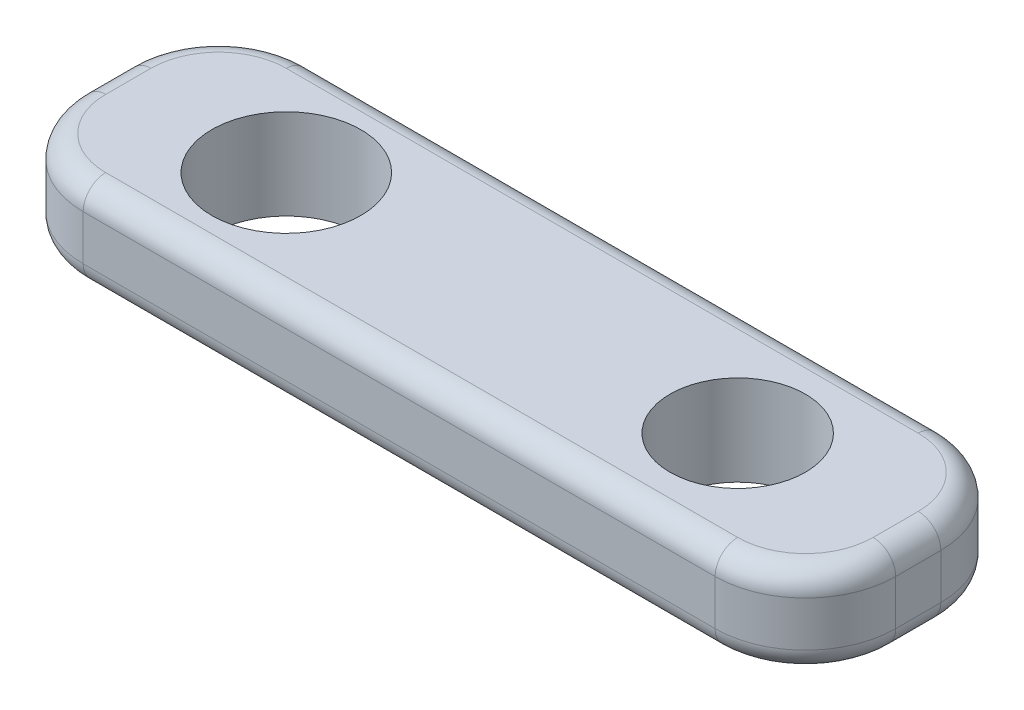
ISO-10303-21;
HEADER;
FILE_DESCRIPTION(('STEP AP214'),'2;1');
FILE_NAME('part.step','',(''),(''),'','','');
FILE_SCHEMA(('AUTOMOTIVE_DESIGN { 1 0 10303 214 1 1 1 1 }'));
ENDSEC;
DATA;
#1=APPLICATION_CONTEXT('core data for automotive mechanical design processes');
#2=APPLICATION_PROTOCOL_DEFINITION('international standard','automotive_design',2000,#1);
#3=PRODUCT_CONTEXT('',#1,'mechanical');
#4=PRODUCT('Part','Part','',(#3));
#5=PRODUCT_RELATED_PRODUCT_CATEGORY('part','',(#4));
#6=PRODUCT_DEFINITION_FORMATION('','',#4);
#7=PRODUCT_DEFINITION_CONTEXT('part definition',#1,'design');
#8=PRODUCT_DEFINITION('design','',#6,#7);
#9=PRODUCT_DEFINITION_SHAPE('','',#8);
#10=(LENGTH_UNIT() NAMED_UNIT(*) SI_UNIT(.MILLI.,.METRE.));
#11=(NAMED_UNIT(*) PLANE_ANGLE_UNIT() SI_UNIT($,.RADIAN.));
#12=(NAMED_UNIT(*) SI_UNIT($,.STERADIAN.) SOLID_ANGLE_UNIT());
#13=UNCERTAINTY_MEASURE_WITH_UNIT(LENGTH_MEASURE(1.E-05),#10,'distance_accuracy_value','');
#14=(GEOMETRIC_REPRESENTATION_CONTEXT(3) GLOBAL_UNCERTAINTY_ASSIGNED_CONTEXT((#13)) GLOBAL_UNIT_ASSIGNED_CONTEXT((#10,
#11,#12)) REPRESENTATION_CONTEXT('',''));
#15=CARTESIAN_POINT('',(0.,0.,0.));
#16=DIRECTION('',(0.,0.,1.));
#17=DIRECTION('',(1.,0.,0.));
#18=AXIS2_PLACEMENT_3D('',#15,#16,#17);
#19=CARTESIAN_POINT('',(7.,2.,-0.5));
#20=DIRECTION('',(0.,-1.,0.));
#21=DIRECTION('',(0.,0.,-1.));
#22=AXIS2_PLACEMENT_3D('',#19,#20,#21);
#23=CYLINDRICAL_SURFACE('',#22,2.);
#24=DIRECTION('',(0.,-1.,0.));
#25=VECTOR('',#24,1.);
#26=CARTESIAN_POINT('',(7.,2.,-2.5));
#27=LINE('',#26,#25);
#28=CARTESIAN_POINT('',(7.,1.5,-2.5));
#29=VERTEX_POINT('',#28);
#30=CARTESIAN_POINT('',(7.,0.5,-2.5));
#31=VERTEX_POINT('',#30);
#32=EDGE_CURVE('E171',#29,#31,#27,.T.);
#33=ORIENTED_EDGE('',*,*,#32,.F.);
#34=CARTESIAN_POINT('',(7.,1.5,-0.5));
#35=DIRECTION('',(0.,-1.,0.));
#36=DIRECTION('',(0.,0.,-1.));
#37=AXIS2_PLACEMENT_3D('',#34,#35,#36);
#38=CIRCLE('',#37,2.);
#39=CARTESIAN_POINT('',(9.,1.5,-0.500000000000001));
#40=VERTEX_POINT('',#39);
#41=EDGE_CURVE('E158',#29,#40,#38,.T.);
#42=ORIENTED_EDGE('',*,*,#41,.T.);
#43=DIRECTION('',(0.,-1.,0.));
#44=VECTOR('',#43,1.);
#45=CARTESIAN_POINT('',(9.,2.,-0.500000000000001));
#46=LINE('',#45,#44);
#47=CARTESIAN_POINT('',(9.,0.5,-0.500000000000001));
#48=VERTEX_POINT('',#47);
#49=EDGE_CURVE('E290',#40,#48,#46,.T.);
#50=ORIENTED_EDGE('',*,*,#49,.T.);
#51=CARTESIAN_POINT('',(7.,0.5,-0.5));
#52=DIRECTION('',(0.,-1.,0.));
#53=DIRECTION('',(0.,0.,-1.));
#54=AXIS2_PLACEMENT_3D('',#51,#52,#53);
#55=CIRCLE('',#54,2.);
#56=EDGE_CURVE('E178',#48,#31,#55,.F.);
#57=ORIENTED_EDGE('',*,*,#56,.T.);
#58=EDGE_LOOP('',(#33,#42,#50,#57));
#59=FACE_BOUND('',#58,.T.);
#60=ADVANCED_FACE('F35',(#59),#23,.T.);
#61=CARTESIAN_POINT('',(-7.,2.,-2.5));
#62=DIRECTION('',(0.,0.,1.));
#63=DIRECTION('',(1.,0.,0.));
#64=AXIS2_PLACEMENT_3D('',#61,#62,#63);
#65=PLANE('',#64);
#66=DIRECTION('',(0.,-1.,0.));
#67=VECTOR('',#66,1.);
#68=CARTESIAN_POINT('',(-7.,2.,-2.5));
#69=LINE('',#68,#67);
#70=CARTESIAN_POINT('',(-7.,1.5,-2.5));
#71=VERTEX_POINT('',#70);
#72=CARTESIAN_POINT('',(-7.,0.5,-2.5));
#73=VERTEX_POINT('',#72);
#74=EDGE_CURVE('E317',#71,#73,#69,.T.);
#75=ORIENTED_EDGE('',*,*,#74,.F.);
#76=DIRECTION('',(-1.,0.,0.));
#77=VECTOR('',#76,1.);
#78=CARTESIAN_POINT('',(-7.,1.5,-2.5));
#79=LINE('',#78,#77);
#80=EDGE_CURVE('E11',#71,#29,#79,.F.);
#81=ORIENTED_EDGE('',*,*,#80,.T.);
#82=ORIENTED_EDGE('',*,*,#32,.T.);
#83=DIRECTION('',(-1.,0.,0.));
#84=VECTOR('',#83,1.);
#85=CARTESIAN_POINT('',(-7.,0.5,-2.5));
#86=LINE('',#85,#84);
#87=EDGE_CURVE('E44',#31,#73,#86,.T.);
#88=ORIENTED_EDGE('',*,*,#87,.T.);
#89=EDGE_LOOP('',(#75,#81,#82,#88));
#90=FACE_BOUND('',#89,.T.);
#91=ADVANCED_FACE('F373',(#90),#65,.F.);
#92=CARTESIAN_POINT('',(-7.,2.,-0.5));
#93=DIRECTION('',(0.,-1.,0.));
#94=DIRECTION('',(0.,0.,-1.));
#95=AXIS2_PLACEMENT_3D('',#92,#93,#94);
#96=CYLINDRICAL_SURFACE('',#95,2.);
#97=DIRECTION('',(0.,-1.,0.));
#98=VECTOR('',#97,1.);
#99=CARTESIAN_POINT('',(-9.,2.,-0.500000000000001));
#100=LINE('',#99,#98);
#101=CARTESIAN_POINT('',(-9.,1.5,-0.500000000000001));
#102=VERTEX_POINT('',#101);
#103=CARTESIAN_POINT('',(-9.,0.5,-0.500000000000001));
#104=VERTEX_POINT('',#103);
#105=EDGE_CURVE('E314',#102,#104,#100,.T.);
#106=ORIENTED_EDGE('',*,*,#105,.F.);
#107=CARTESIAN_POINT('',(-7.,1.5,-0.5));
#108=DIRECTION('',(0.,-1.,0.));
#109=DIRECTION('',(0.,0.,-1.));
#110=AXIS2_PLACEMENT_3D('',#107,#108,#109);
#111=CIRCLE('',#110,2.);
#112=EDGE_CURVE('E209',#102,#71,#111,.T.);
#113=ORIENTED_EDGE('',*,*,#112,.T.);
#114=ORIENTED_EDGE('',*,*,#74,.T.);
#115=CARTESIAN_POINT('',(-7.,0.5,-0.5));
#116=DIRECTION('',(0.,-1.,0.));
#117=DIRECTION('',(0.,0.,-1.));
#118=AXIS2_PLACEMENT_3D('',#115,#116,#117);
#119=CIRCLE('',#118,2.);
#120=EDGE_CURVE('E207',#73,#104,#119,.F.);
#121=ORIENTED_EDGE('',*,*,#120,.T.);
#122=EDGE_LOOP('',(#106,#113,#114,#121));
#123=FACE_BOUND('',#122,.T.);
#124=ADVANCED_FACE('F375',(#123),#96,.T.);
#125=CARTESIAN_POINT('',(-9.,2.,-0.5));
#126=DIRECTION('',(1.,0.,0.));
#127=DIRECTION('',(0.,0.,-1.));
#128=AXIS2_PLACEMENT_3D('',#125,#126,#127);
#129=PLANE('',#128);
#130=DIRECTION('',(0.,-1.,0.));
#131=VECTOR('',#130,1.);
#132=CARTESIAN_POINT('',(-9.,2.,0.5));
#133=LINE('',#132,#131);
#134=CARTESIAN_POINT('',(-9.,1.5,0.5));
#135=VERTEX_POINT('',#134);
#136=CARTESIAN_POINT('',(-9.,0.5,0.5));
#137=VERTEX_POINT('',#136);
#138=EDGE_CURVE('E311',#135,#137,#133,.T.);
#139=ORIENTED_EDGE('',*,*,#138,.F.);
#140=DIRECTION('',(0.,0.,1.));
#141=VECTOR('',#140,1.);
#142=CARTESIAN_POINT('',(-9.,1.5,-0.5));
#143=LINE('',#142,#141);
#144=EDGE_CURVE('E205',#135,#102,#143,.F.);
#145=ORIENTED_EDGE('',*,*,#144,.T.);
#146=ORIENTED_EDGE('',*,*,#105,.T.);
#147=DIRECTION('',(0.,0.,1.));
#148=VECTOR('',#147,1.);
#149=CARTESIAN_POINT('',(-9.,0.5,0.5));
#150=LINE('',#149,#148);
#151=EDGE_CURVE('E203',#104,#137,#150,.T.);
#152=ORIENTED_EDGE('',*,*,#151,.T.);
#153=EDGE_LOOP('',(#139,#145,#146,#152));
#154=FACE_BOUND('',#153,.T.);
#155=ADVANCED_FACE('F357',(#154),#129,.F.);
#156=CARTESIAN_POINT('',(-7.,2.,0.5));
#157=DIRECTION('',(0.,-1.,0.));
#158=DIRECTION('',(0.,0.,-1.));
#159=AXIS2_PLACEMENT_3D('',#156,#157,#158);
#160=CYLINDRICAL_SURFACE('',#159,2.);
#161=DIRECTION('',(0.,-1.,0.));
#162=VECTOR('',#161,1.);
#163=CARTESIAN_POINT('',(-7.,2.,2.5));
#164=LINE('',#163,#162);
#165=CARTESIAN_POINT('',(-7.,1.5,2.5));
#166=VERTEX_POINT('',#165);
#167=CARTESIAN_POINT('',(-7.,0.5,2.5));
#168=VERTEX_POINT('',#167);
#169=EDGE_CURVE('E308',#166,#168,#164,.T.);
#170=ORIENTED_EDGE('',*,*,#169,.F.);
#171=CARTESIAN_POINT('',(-7.,1.5,0.5));
#172=DIRECTION('',(0.,-1.,0.));
#173=DIRECTION('',(0.,0.,-1.));
#174=AXIS2_PLACEMENT_3D('',#171,#172,#173);
#175=CIRCLE('',#174,2.);
#176=EDGE_CURVE('E201',#166,#135,#175,.T.);
#177=ORIENTED_EDGE('',*,*,#176,.T.);
#178=ORIENTED_EDGE('',*,*,#138,.T.);
#179=CARTESIAN_POINT('',(-7.,0.5,0.5));
#180=DIRECTION('',(0.,-1.,0.));
#181=DIRECTION('',(0.,0.,-1.));
#182=AXIS2_PLACEMENT_3D('',#179,#180,#181);
#183=CIRCLE('',#182,2.);
#184=EDGE_CURVE('E199',#137,#168,#183,.F.);
#185=ORIENTED_EDGE('',*,*,#184,.T.);
#186=EDGE_LOOP('',(#170,#177,#178,#185));
#187=FACE_BOUND('',#186,.T.);
#188=ADVANCED_FACE('F355',(#187),#160,.T.);
#189=CARTESIAN_POINT('',(-7.,2.,2.5));
#190=DIRECTION('',(0.,0.,-1.));
#191=DIRECTION('',(-1.,0.,0.));
#192=AXIS2_PLACEMENT_3D('',#189,#190,#191);
#193=PLANE('',#192);
#194=DIRECTION('',(0.,-1.,0.));
#195=VECTOR('',#194,1.);
#196=CARTESIAN_POINT('',(7.,2.,2.5));
#197=LINE('',#196,#195);
#198=CARTESIAN_POINT('',(7.,1.5,2.5));
#199=VERTEX_POINT('',#198);
#200=CARTESIAN_POINT('',(7.,0.5,2.5));
#201=VERTEX_POINT('',#200);
#202=EDGE_CURVE('E298',#199,#201,#197,.T.);
#203=ORIENTED_EDGE('',*,*,#202,.F.);
#204=DIRECTION('',(1.,0.,0.));
#205=VECTOR('',#204,1.);
#206=CARTESIAN_POINT('',(-7.,1.5,2.5));
#207=LINE('',#206,#205);
#208=EDGE_CURVE('E197',#199,#166,#207,.F.);
#209=ORIENTED_EDGE('',*,*,#208,.T.);
#210=ORIENTED_EDGE('',*,*,#169,.T.);
#211=DIRECTION('',(1.,0.,0.));
#212=VECTOR('',#211,1.);
#213=CARTESIAN_POINT('',(7.,0.5,2.5));
#214=LINE('',#213,#212);
#215=EDGE_CURVE('E195',#168,#201,#214,.T.);
#216=ORIENTED_EDGE('',*,*,#215,.T.);
#217=EDGE_LOOP('',(#203,#209,#210,#216));
#218=FACE_BOUND('',#217,.T.);
#219=ADVANCED_FACE('F342',(#218),#193,.F.);
#220=CARTESIAN_POINT('',(7.,2.,0.5));
#221=DIRECTION('',(0.,-1.,0.));
#222=DIRECTION('',(0.,0.,-1.));
#223=AXIS2_PLACEMENT_3D('',#220,#221,#222);
#224=CYLINDRICAL_SURFACE('',#223,2.);
#225=DIRECTION('',(0.,-1.,0.));
#226=VECTOR('',#225,1.);
#227=CARTESIAN_POINT('',(9.,2.,0.499999999999999));
#228=LINE('',#227,#226);
#229=CARTESIAN_POINT('',(9.,1.5,0.499999999999999));
#230=VERTEX_POINT('',#229);
#231=CARTESIAN_POINT('',(9.,0.5,0.499999999999999));
#232=VERTEX_POINT('',#231);
#233=EDGE_CURVE('E292',#230,#232,#228,.T.);
#234=ORIENTED_EDGE('',*,*,#233,.F.);
#235=CARTESIAN_POINT('',(7.,1.5,0.5));
#236=DIRECTION('',(0.,-1.,0.));
#237=DIRECTION('',(0.,0.,-1.));
#238=AXIS2_PLACEMENT_3D('',#235,#236,#237);
#239=CIRCLE('',#238,2.);
#240=EDGE_CURVE('E193',#230,#199,#239,.T.);
#241=ORIENTED_EDGE('',*,*,#240,.T.);
#242=ORIENTED_EDGE('',*,*,#202,.T.);
#243=CARTESIAN_POINT('',(7.,0.5,0.5));
#244=DIRECTION('',(0.,-1.,0.));
#245=DIRECTION('',(0.,0.,-1.));
#246=AXIS2_PLACEMENT_3D('',#243,#244,#245);
#247=CIRCLE('',#246,2.);
#248=EDGE_CURVE('E191',#201,#232,#247,.F.);
#249=ORIENTED_EDGE('',*,*,#248,.T.);
#250=EDGE_LOOP('',(#234,#241,#242,#249));
#251=FACE_BOUND('',#250,.T.);
#252=ADVANCED_FACE('F338',(#251),#224,.T.);
#253=CARTESIAN_POINT('',(9.,2.,-0.500000000000001));
#254=DIRECTION('',(-1.,0.,0.));
#255=DIRECTION('',(0.,0.,1.));
#256=AXIS2_PLACEMENT_3D('',#253,#254,#255);
#257=PLANE('',#256);
#258=ORIENTED_EDGE('',*,*,#49,.F.);
#259=DIRECTION('',(0.,0.,-1.));
#260=VECTOR('',#259,1.);
#261=CARTESIAN_POINT('',(9.,1.5,-0.500000000000001));
#262=LINE('',#261,#260);
#263=EDGE_CURVE('E189',#40,#230,#262,.F.);
#264=ORIENTED_EDGE('',*,*,#263,.T.);
#265=ORIENTED_EDGE('',*,*,#233,.T.);
#266=DIRECTION('',(0.,0.,-1.));
#267=VECTOR('',#266,1.);
#268=CARTESIAN_POINT('',(9.,0.5,-0.500000000000001));
#269=LINE('',#268,#267);
#270=EDGE_CURVE('E187',#232,#48,#269,.T.);
#271=ORIENTED_EDGE('',*,*,#270,.T.);
#272=EDGE_LOOP('',(#258,#264,#265,#271));
#273=FACE_BOUND('',#272,.T.);
#274=ADVANCED_FACE('F289',(#273),#257,.F.);
#275=CARTESIAN_POINT('',(7.,2.,-0.5));
#276=DIRECTION('',(0.,-1.,0.));
#277=DIRECTION('',(0.,0.,-1.));
#278=AXIS2_PLACEMENT_3D('',#275,#276,#277);
#279=PLANE('',#278);
#280=DIRECTION('',(0.,0.,-1.));
#281=VECTOR('',#280,1.);
#282=CARTESIAN_POINT('',(8.49999999999999,2.,-0.5));
#283=LINE('',#282,#281);
#284=CARTESIAN_POINT('',(8.5,2.,0.499999999999999));
#285=VERTEX_POINT('',#284);
#286=CARTESIAN_POINT('',(8.49999999999999,2.,-0.500000000000001));
#287=VERTEX_POINT('',#286);
#288=EDGE_CURVE('E176',#285,#287,#283,.T.);
#289=ORIENTED_EDGE('',*,*,#288,.T.);
#290=CARTESIAN_POINT('',(7.,2.,-0.5));
#291=DIRECTION('',(0.,-1.,0.));
#292=DIRECTION('',(0.,0.,-1.));
#293=AXIS2_PLACEMENT_3D('',#290,#291,#292);
#294=CIRCLE('',#293,1.5);
#295=CARTESIAN_POINT('',(7.,2.,-2.));
#296=VERTEX_POINT('',#295);
#297=EDGE_CURVE('E156',#287,#296,#294,.F.);
#298=ORIENTED_EDGE('',*,*,#297,.T.);
#299=DIRECTION('',(-1.,0.,0.));
#300=VECTOR('',#299,1.);
#301=CARTESIAN_POINT('',(7.,2.,-2.));
#302=LINE('',#301,#300);
#303=CARTESIAN_POINT('',(-7.,2.,-2.));
#304=VERTEX_POINT('',#303);
#305=EDGE_CURVE('E164',#296,#304,#302,.T.);
#306=ORIENTED_EDGE('',*,*,#305,.T.);
#307=CARTESIAN_POINT('',(-7.,2.,-0.5));
#308=DIRECTION('',(0.,-1.,0.));
#309=DIRECTION('',(0.,0.,-1.));
#310=AXIS2_PLACEMENT_3D('',#307,#308,#309);
#311=CIRCLE('',#310,1.5);
#312=CARTESIAN_POINT('',(-8.5,2.,-0.5));
#313=VERTEX_POINT('',#312);
#314=EDGE_CURVE('E170',#304,#313,#311,.F.);
#315=ORIENTED_EDGE('',*,*,#314,.T.);
#316=DIRECTION('',(0.,0.,1.));
#317=VECTOR('',#316,1.);
#318=CARTESIAN_POINT('',(-8.5,2.,-0.500000000000027));
#319=LINE('',#318,#317);
#320=CARTESIAN_POINT('',(-8.5,2.,0.5));
#321=VERTEX_POINT('',#320);
#322=EDGE_CURVE('E322',#313,#321,#319,.T.);
#323=ORIENTED_EDGE('',*,*,#322,.T.);
#324=CARTESIAN_POINT('',(-7.,2.,0.5));
#325=DIRECTION('',(0.,-1.,0.));
#326=DIRECTION('',(0.,0.,-1.));
#327=AXIS2_PLACEMENT_3D('',#324,#325,#326);
#328=CIRCLE('',#327,1.5);
#329=CARTESIAN_POINT('',(-7.,2.,2.));
#330=VERTEX_POINT('',#329);
#331=EDGE_CURVE('E324',#321,#330,#328,.F.);
#332=ORIENTED_EDGE('',*,*,#331,.T.);
#333=DIRECTION('',(1.,0.,0.));
#334=VECTOR('',#333,1.);
#335=CARTESIAN_POINT('',(7.,2.,2.));
#336=LINE('',#335,#334);
#337=CARTESIAN_POINT('',(7.,2.,2.));
#338=VERTEX_POINT('',#337);
#339=EDGE_CURVE('E326',#330,#338,#336,.T.);
#340=ORIENTED_EDGE('',*,*,#339,.T.);
#341=CARTESIAN_POINT('',(7.,2.,0.5));
#342=DIRECTION('',(0.,-1.,0.));
#343=DIRECTION('',(0.,0.,-1.));
#344=AXIS2_PLACEMENT_3D('',#341,#342,#343);
#345=CIRCLE('',#344,1.5);
#346=EDGE_CURVE('E182',#338,#285,#345,.F.);
#347=ORIENTED_EDGE('',*,*,#346,.T.);
#348=EDGE_LOOP('',(#289,#298,#306,#315,#323,#332,#340,#347));
#349=FACE_BOUND('',#348,.T.);
#350=CARTESIAN_POINT('',(-5.,2.,0.));
#351=DIRECTION('',(0.,1.,0.));
#352=DIRECTION('',(0.,0.,1.));
#353=AXIS2_PLACEMENT_3D('',#350,#351,#352);
#354=CIRCLE('',#353,1.65);
#355=CARTESIAN_POINT('',(-5.,2.,1.65));
#356=VERTEX_POINT('',#355);
#357=EDGE_CURVE('E301',#356,#356,#354,.T.);
#358=ORIENTED_EDGE('',*,*,#357,.F.);
#359=EDGE_LOOP('',(#358));
#360=FACE_BOUND('',#359,.T.);
#361=CARTESIAN_POINT('',(5.,2.,0.));
#362=DIRECTION('',(0.,1.,0.));
#363=DIRECTION('',(0.,0.,1.));
#364=AXIS2_PLACEMENT_3D('',#361,#362,#363);
#365=CIRCLE('',#364,1.5);
#366=CARTESIAN_POINT('',(5.,2.,1.5));
#367=VERTEX_POINT('',#366);
#368=EDGE_CURVE('E244',#367,#367,#365,.T.);
#369=ORIENTED_EDGE('',*,*,#368,.F.);
#370=EDGE_LOOP('',(#369));
#371=FACE_BOUND('',#370,.T.);
#372=ADVANCED_FACE('F173',(#349,#360,#371),#279,.F.);
#373=CARTESIAN_POINT('',(7.,0.,-0.5));
#374=DIRECTION('',(0.,-1.,0.));
#375=DIRECTION('',(0.,0.,-1.));
#376=AXIS2_PLACEMENT_3D('',#373,#374,#375);
#377=PLANE('',#376);
#378=DIRECTION('',(-1.,0.,0.));
#379=VECTOR('',#378,1.);
#380=CARTESIAN_POINT('',(7.,0.,-2.));
#381=LINE('',#380,#379);
#382=CARTESIAN_POINT('',(-7.,0.,-2.));
#383=VERTEX_POINT('',#382);
#384=CARTESIAN_POINT('',(7.,0.,-2.));
#385=VERTEX_POINT('',#384);
#386=EDGE_CURVE('E211',#383,#385,#381,.F.);
#387=ORIENTED_EDGE('',*,*,#386,.T.);
#388=CARTESIAN_POINT('',(7.,0.,-0.5));
#389=DIRECTION('',(0.,-1.,0.));
#390=DIRECTION('',(0.,0.,-1.));
#391=AXIS2_PLACEMENT_3D('',#388,#389,#390);
#392=CIRCLE('',#391,1.5);
#393=CARTESIAN_POINT('',(8.49999999999999,0.,-0.500000000000001));
#394=VERTEX_POINT('',#393);
#395=EDGE_CURVE('E224',#385,#394,#392,.T.);
#396=ORIENTED_EDGE('',*,*,#395,.T.);
#397=DIRECTION('',(0.,0.,-1.));
#398=VECTOR('',#397,1.);
#399=CARTESIAN_POINT('',(8.49999999999999,0.,0.499999999999999));
#400=LINE('',#399,#398);
#401=CARTESIAN_POINT('',(8.5,0.,0.499999999999999));
#402=VERTEX_POINT('',#401);
#403=EDGE_CURVE('E59',#394,#402,#400,.F.);
#404=ORIENTED_EDGE('',*,*,#403,.T.);
#405=CARTESIAN_POINT('',(7.,0.,0.5));
#406=DIRECTION('',(0.,-1.,0.));
#407=DIRECTION('',(0.,0.,-1.));
#408=AXIS2_PLACEMENT_3D('',#405,#406,#407);
#409=CIRCLE('',#408,1.5);
#410=CARTESIAN_POINT('',(7.,0.,2.));
#411=VERTEX_POINT('',#410);
#412=EDGE_CURVE('E221',#402,#411,#409,.T.);
#413=ORIENTED_EDGE('',*,*,#412,.T.);
#414=DIRECTION('',(1.,0.,0.));
#415=VECTOR('',#414,1.);
#416=CARTESIAN_POINT('',(-7.,0.,2.));
#417=LINE('',#416,#415);
#418=CARTESIAN_POINT('',(-7.,0.,2.));
#419=VERTEX_POINT('',#418);
#420=EDGE_CURVE('E219',#411,#419,#417,.F.);
#421=ORIENTED_EDGE('',*,*,#420,.T.);
#422=CARTESIAN_POINT('',(-7.,0.,0.5));
#423=DIRECTION('',(0.,-1.,0.));
#424=DIRECTION('',(0.,0.,-1.));
#425=AXIS2_PLACEMENT_3D('',#422,#423,#424);
#426=CIRCLE('',#425,1.5);
#427=CARTESIAN_POINT('',(-8.5,0.,0.5));
#428=VERTEX_POINT('',#427);
#429=EDGE_CURVE('E217',#419,#428,#426,.T.);
#430=ORIENTED_EDGE('',*,*,#429,.T.);
#431=DIRECTION('',(0.,0.,1.));
#432=VECTOR('',#431,1.);
#433=CARTESIAN_POINT('',(-8.5,0.,-0.5));
#434=LINE('',#433,#432);
#435=CARTESIAN_POINT('',(-8.5,0.,-0.5));
#436=VERTEX_POINT('',#435);
#437=EDGE_CURVE('E215',#428,#436,#434,.F.);
#438=ORIENTED_EDGE('',*,*,#437,.T.);
#439=CARTESIAN_POINT('',(-7.,0.,-0.5));
#440=DIRECTION('',(0.,-1.,0.));
#441=DIRECTION('',(0.,0.,-1.));
#442=AXIS2_PLACEMENT_3D('',#439,#440,#441);
#443=CIRCLE('',#442,1.5);
#444=EDGE_CURVE('E213',#436,#383,#443,.T.);
#445=ORIENTED_EDGE('',*,*,#444,.T.);
#446=EDGE_LOOP('',(#387,#396,#404,#413,#421,#430,#438,#445));
#447=FACE_BOUND('',#446,.T.);
#448=CARTESIAN_POINT('',(-5.,0.,0.));
#449=DIRECTION('',(0.,1.,0.));
#450=DIRECTION('',(0.,0.,1.));
#451=AXIS2_PLACEMENT_3D('',#448,#449,#450);
#452=CIRCLE('',#451,1.65);
#453=CARTESIAN_POINT('',(-5.,0.,1.65));
#454=VERTEX_POINT('',#453);
#455=EDGE_CURVE('E296',#454,#454,#452,.T.);
#456=ORIENTED_EDGE('',*,*,#455,.T.);
#457=EDGE_LOOP('',(#456));
#458=FACE_BOUND('',#457,.T.);
#459=CARTESIAN_POINT('',(5.,0.,0.));
#460=DIRECTION('',(0.,1.,0.));
#461=DIRECTION('',(0.,0.,1.));
#462=AXIS2_PLACEMENT_3D('',#459,#460,#461);
#463=CIRCLE('',#462,1.5);
#464=CARTESIAN_POINT('',(5.,0.,1.5));
#465=VERTEX_POINT('',#464);
#466=EDGE_CURVE('E612',#465,#465,#463,.T.);
#467=ORIENTED_EDGE('',*,*,#466,.T.);
#468=EDGE_LOOP('',(#467));
#469=FACE_BOUND('',#468,.T.);
#470=ADVANCED_FACE('F275',(#447,#458,#469),#377,.T.);
#471=CARTESIAN_POINT('',(5.,0.,0.));
#472=DIRECTION('',(0.,1.,0.));
#473=DIRECTION('',(0.,0.,1.));
#474=AXIS2_PLACEMENT_3D('',#471,#472,#473);
#475=CYLINDRICAL_SURFACE('',#474,1.5);
#476=ORIENTED_EDGE('',*,*,#466,.F.);
#477=EDGE_LOOP('',(#476));
#478=FACE_BOUND('',#477,.T.);
#479=ORIENTED_EDGE('',*,*,#368,.T.);
#480=EDGE_LOOP('',(#479));
#481=FACE_BOUND('',#480,.T.);
#482=ADVANCED_FACE('F522',(#478,#481),#475,.F.);
#483=CARTESIAN_POINT('',(-5.,0.,0.));
#484=DIRECTION('',(0.,1.,0.));
#485=DIRECTION('',(0.,0.,1.));
#486=AXIS2_PLACEMENT_3D('',#483,#484,#485);
#487=CYLINDRICAL_SURFACE('',#486,1.65);
#488=ORIENTED_EDGE('',*,*,#455,.F.);
#489=EDGE_LOOP('',(#488));
#490=FACE_BOUND('',#489,.T.);
#491=ORIENTED_EDGE('',*,*,#357,.T.);
#492=EDGE_LOOP('',(#491));
#493=FACE_BOUND('',#492,.T.);
#494=ADVANCED_FACE('F513',(#490,#493),#487,.F.);
#495=CARTESIAN_POINT('',(-7.,1.5,0.5));
#496=DIRECTION('',(0.,-1.,0.));
#497=DIRECTION('',(0.,0.,-1.));
#498=AXIS2_PLACEMENT_3D('',#495,#496,#497);
#499=TOROIDAL_SURFACE('',#498,1.5,0.5);
#500=CARTESIAN_POINT('',(-8.5,1.5,0.5));
#501=DIRECTION('',(0.,0.,-1.));
#502=DIRECTION('',(-1.,0.,0.));
#503=AXIS2_PLACEMENT_3D('',#500,#501,#502);
#504=CIRCLE('',#503,0.5);
#505=EDGE_CURVE('E238',#135,#321,#504,.T.);
#506=ORIENTED_EDGE('',*,*,#505,.F.);
#507=ORIENTED_EDGE('',*,*,#176,.F.);
#508=CARTESIAN_POINT('',(-7.,1.5,2.));
#509=DIRECTION('',(1.,0.,0.));
#510=DIRECTION('',(0.,0.,-1.));
#511=AXIS2_PLACEMENT_3D('',#508,#509,#510);
#512=CIRCLE('',#511,0.5);
#513=EDGE_CURVE('E241',#330,#166,#512,.T.);
#514=ORIENTED_EDGE('',*,*,#513,.F.);
#515=ORIENTED_EDGE('',*,*,#331,.F.);
#516=EDGE_LOOP('',(#506,#507,#514,#515));
#517=FACE_BOUND('',#516,.T.);
#518=ADVANCED_FACE('F351',(#517),#499,.T.);
#519=CARTESIAN_POINT('',(7.,1.5,2.));
#520=DIRECTION('',(1.,0.,0.));
#521=DIRECTION('',(0.,0.,-1.));
#522=AXIS2_PLACEMENT_3D('',#519,#520,#521);
#523=CYLINDRICAL_SURFACE('',#522,0.5);
#524=ORIENTED_EDGE('',*,*,#513,.T.);
#525=ORIENTED_EDGE('',*,*,#208,.F.);
#526=CARTESIAN_POINT('',(7.,1.5,2.));
#527=DIRECTION('',(1.,0.,0.));
#528=DIRECTION('',(0.,0.,-1.));
#529=AXIS2_PLACEMENT_3D('',#526,#527,#528);
#530=CIRCLE('',#529,0.5);
#531=EDGE_CURVE('E235',#338,#199,#530,.T.);
#532=ORIENTED_EDGE('',*,*,#531,.F.);
#533=ORIENTED_EDGE('',*,*,#339,.F.);
#534=EDGE_LOOP('',(#524,#525,#532,#533));
#535=FACE_BOUND('',#534,.T.);
#536=ADVANCED_FACE('F345',(#535),#523,.T.);
#537=CARTESIAN_POINT('',(-8.5,1.5,-0.500000000000027));
#538=DIRECTION('',(0.,0.,1.));
#539=DIRECTION('',(1.,0.,0.));
#540=AXIS2_PLACEMENT_3D('',#537,#538,#539);
#541=CYLINDRICAL_SURFACE('',#540,0.5);
#542=ORIENTED_EDGE('',*,*,#505,.T.);
#543=ORIENTED_EDGE('',*,*,#322,.F.);
#544=CARTESIAN_POINT('',(-8.5,1.5,-0.5));
#545=DIRECTION('',(0.,0.,-1.));
#546=DIRECTION('',(-1.,0.,0.));
#547=AXIS2_PLACEMENT_3D('',#544,#545,#546);
#548=CIRCLE('',#547,0.5);
#549=EDGE_CURVE('E232',#102,#313,#548,.T.);
#550=ORIENTED_EDGE('',*,*,#549,.F.);
#551=ORIENTED_EDGE('',*,*,#144,.F.);
#552=EDGE_LOOP('',(#542,#543,#550,#551));
#553=FACE_BOUND('',#552,.T.);
#554=ADVANCED_FACE('F382',(#553),#541,.T.);
#555=CARTESIAN_POINT('',(7.,1.5,0.5));
#556=DIRECTION('',(0.,-1.,0.));
#557=DIRECTION('',(0.,0.,-1.));
#558=AXIS2_PLACEMENT_3D('',#555,#556,#557);
#559=TOROIDAL_SURFACE('',#558,1.5,0.5);
#560=ORIENTED_EDGE('',*,*,#531,.T.);
#561=ORIENTED_EDGE('',*,*,#240,.F.);
#562=CARTESIAN_POINT('',(8.5,1.5,0.499999999999999));
#563=DIRECTION('',(0.,0.,-1.));
#564=DIRECTION('',(-1.,0.,0.));
#565=AXIS2_PLACEMENT_3D('',#562,#563,#564);
#566=CIRCLE('',#565,0.5);
#567=EDGE_CURVE('E229',#285,#230,#566,.T.);
#568=ORIENTED_EDGE('',*,*,#567,.F.);
#569=ORIENTED_EDGE('',*,*,#346,.F.);
#570=EDGE_LOOP('',(#560,#561,#568,#569));
#571=FACE_BOUND('',#570,.T.);
#572=ADVANCED_FACE('F333',(#571),#559,.T.);
#573=CARTESIAN_POINT('',(-7.,1.5,-0.5));
#574=DIRECTION('',(0.,-1.,0.));
#575=DIRECTION('',(0.,0.,-1.));
#576=AXIS2_PLACEMENT_3D('',#573,#574,#575);
#577=TOROIDAL_SURFACE('',#576,1.5,0.5);
#578=ORIENTED_EDGE('',*,*,#549,.T.);
#579=ORIENTED_EDGE('',*,*,#314,.F.);
#580=CARTESIAN_POINT('',(-7.,1.5,-2.));
#581=DIRECTION('',(1.,0.,0.));
#582=DIRECTION('',(0.,0.,-1.));
#583=AXIS2_PLACEMENT_3D('',#580,#581,#582);
#584=CIRCLE('',#583,0.5);
#585=EDGE_CURVE('E167',#71,#304,#584,.T.);
#586=ORIENTED_EDGE('',*,*,#585,.F.);
#587=ORIENTED_EDGE('',*,*,#112,.F.);
#588=EDGE_LOOP('',(#578,#579,#586,#587));
#589=FACE_BOUND('',#588,.T.);
#590=ADVANCED_FACE('F379',(#589),#577,.T.);
#591=CARTESIAN_POINT('',(8.49999999999999,1.5,-0.5));
#592=DIRECTION('',(0.,0.,-1.));
#593=DIRECTION('',(-1.,0.,0.));
#594=AXIS2_PLACEMENT_3D('',#591,#592,#593);
#595=CYLINDRICAL_SURFACE('',#594,0.5);
#596=ORIENTED_EDGE('',*,*,#567,.T.);
#597=ORIENTED_EDGE('',*,*,#263,.F.);
#598=CARTESIAN_POINT('',(8.49999999999999,1.5,-0.500000000000001));
#599=DIRECTION('',(0.,0.,-1.));
#600=DIRECTION('',(-1.,0.,0.));
#601=AXIS2_PLACEMENT_3D('',#598,#599,#600);
#602=CIRCLE('',#601,0.5);
#603=EDGE_CURVE('E161',#287,#40,#602,.T.);
#604=ORIENTED_EDGE('',*,*,#603,.F.);
#605=ORIENTED_EDGE('',*,*,#288,.F.);
#606=EDGE_LOOP('',(#596,#597,#604,#605));
#607=FACE_BOUND('',#606,.T.);
#608=ADVANCED_FACE('F336',(#607),#595,.T.);
#609=CARTESIAN_POINT('',(7.,1.5,-2.));
#610=DIRECTION('',(-1.,0.,0.));
#611=DIRECTION('',(0.,0.,1.));
#612=AXIS2_PLACEMENT_3D('',#609,#610,#611);
#613=CYLINDRICAL_SURFACE('',#612,0.5);
#614=ORIENTED_EDGE('',*,*,#585,.T.);
#615=ORIENTED_EDGE('',*,*,#305,.F.);
#616=CARTESIAN_POINT('',(7.,1.5,-2.));
#617=DIRECTION('',(1.,0.,0.));
#618=DIRECTION('',(0.,0.,-1.));
#619=AXIS2_PLACEMENT_3D('',#616,#617,#618);
#620=CIRCLE('',#619,0.5);
#621=EDGE_CURVE('E152',#29,#296,#620,.T.);
#622=ORIENTED_EDGE('',*,*,#621,.F.);
#623=ORIENTED_EDGE('',*,*,#80,.F.);
#624=EDGE_LOOP('',(#614,#615,#622,#623));
#625=FACE_BOUND('',#624,.T.);
#626=ADVANCED_FACE('F165',(#625),#613,.T.);
#627=CARTESIAN_POINT('',(7.,1.5,-0.5));
#628=DIRECTION('',(0.,-1.,0.));
#629=DIRECTION('',(0.,0.,-1.));
#630=AXIS2_PLACEMENT_3D('',#627,#628,#629);
#631=TOROIDAL_SURFACE('',#630,1.5,0.5);
#632=ORIENTED_EDGE('',*,*,#603,.T.);
#633=ORIENTED_EDGE('',*,*,#41,.F.);
#634=ORIENTED_EDGE('',*,*,#621,.T.);
#635=ORIENTED_EDGE('',*,*,#297,.F.);
#636=EDGE_LOOP('',(#632,#633,#634,#635));
#637=FACE_BOUND('',#636,.T.);
#638=ADVANCED_FACE('F154',(#637),#631,.T.);
#639=CARTESIAN_POINT('',(-7.,0.5,0.5));
#640=DIRECTION('',(0.,-1.,0.));
#641=DIRECTION('',(0.,0.,-1.));
#642=AXIS2_PLACEMENT_3D('',#639,#640,#641);
#643=TOROIDAL_SURFACE('',#642,1.5,0.5);
#644=CARTESIAN_POINT('',(-8.5,0.5,0.5));
#645=DIRECTION('',(0.,0.,-1.));
#646=DIRECTION('',(-1.,0.,0.));
#647=AXIS2_PLACEMENT_3D('',#644,#645,#646);
#648=CIRCLE('',#647,0.5);
#649=EDGE_CURVE('E259',#428,#137,#648,.T.);
#650=ORIENTED_EDGE('',*,*,#649,.F.);
#651=ORIENTED_EDGE('',*,*,#429,.F.);
#652=CARTESIAN_POINT('',(-7.,0.5,2.));
#653=DIRECTION('',(1.,0.,0.));
#654=DIRECTION('',(0.,0.,-1.));
#655=AXIS2_PLACEMENT_3D('',#652,#653,#654);
#656=CIRCLE('',#655,0.5);
#657=EDGE_CURVE('E39',#168,#419,#656,.T.);
#658=ORIENTED_EDGE('',*,*,#657,.F.);
#659=ORIENTED_EDGE('',*,*,#184,.F.);
#660=EDGE_LOOP('',(#650,#651,#658,#659));
#661=FACE_BOUND('',#660,.T.);
#662=ADVANCED_FACE('F37',(#661),#643,.T.);
#663=CARTESIAN_POINT('',(-7.,0.5,2.));
#664=DIRECTION('',(-1.,0.,0.));
#665=DIRECTION('',(0.,0.,1.));
#666=AXIS2_PLACEMENT_3D('',#663,#664,#665);
#667=CYLINDRICAL_SURFACE('',#666,0.5);
#668=ORIENTED_EDGE('',*,*,#657,.T.);
#669=ORIENTED_EDGE('',*,*,#420,.F.);
#670=CARTESIAN_POINT('',(7.,0.5,2.));
#671=DIRECTION('',(1.,0.,0.));
#672=DIRECTION('',(0.,0.,-1.));
#673=AXIS2_PLACEMENT_3D('',#670,#671,#672);
#674=CIRCLE('',#673,0.5);
#675=EDGE_CURVE('E257',#201,#411,#674,.T.);
#676=ORIENTED_EDGE('',*,*,#675,.F.);
#677=ORIENTED_EDGE('',*,*,#215,.F.);
#678=EDGE_LOOP('',(#668,#669,#676,#677));
#679=FACE_BOUND('',#678,.T.);
#680=ADVANCED_FACE('F270',(#679),#667,.T.);
#681=CARTESIAN_POINT('',(-8.5,0.5,-0.499999999999999));
#682=DIRECTION('',(0.,0.,-1.));
#683=DIRECTION('',(-1.,0.,0.));
#684=AXIS2_PLACEMENT_3D('',#681,#682,#683);
#685=CYLINDRICAL_SURFACE('',#684,0.5);
#686=ORIENTED_EDGE('',*,*,#649,.T.);
#687=ORIENTED_EDGE('',*,*,#151,.F.);
#688=CARTESIAN_POINT('',(-8.5,0.5,-0.5));
#689=DIRECTION('',(0.,0.,-1.));
#690=DIRECTION('',(-1.,0.,0.));
#691=AXIS2_PLACEMENT_3D('',#688,#689,#690);
#692=CIRCLE('',#691,0.5);
#693=EDGE_CURVE('E254',#436,#104,#692,.T.);
#694=ORIENTED_EDGE('',*,*,#693,.F.);
#695=ORIENTED_EDGE('',*,*,#437,.F.);
#696=EDGE_LOOP('',(#686,#687,#694,#695));
#697=FACE_BOUND('',#696,.T.);
#698=ADVANCED_FACE('F359',(#697),#685,.T.);
#699=CARTESIAN_POINT('',(7.,0.5,0.5));
#700=DIRECTION('',(0.,-1.,0.));
#701=DIRECTION('',(0.,0.,-1.));
#702=AXIS2_PLACEMENT_3D('',#699,#700,#701);
#703=TOROIDAL_SURFACE('',#702,1.5,0.5);
#704=ORIENTED_EDGE('',*,*,#675,.T.);
#705=ORIENTED_EDGE('',*,*,#412,.F.);
#706=CARTESIAN_POINT('',(8.49999999999999,0.5,0.499999999999999));
#707=DIRECTION('',(0.,0.,-1.));
#708=DIRECTION('',(-1.,0.,0.));
#709=AXIS2_PLACEMENT_3D('',#706,#707,#708);
#710=CIRCLE('',#709,0.5);
#711=EDGE_CURVE('E251',#232,#402,#710,.T.);
#712=ORIENTED_EDGE('',*,*,#711,.F.);
#713=ORIENTED_EDGE('',*,*,#248,.F.);
#714=EDGE_LOOP('',(#704,#705,#712,#713));
#715=FACE_BOUND('',#714,.T.);
#716=ADVANCED_FACE('F280',(#715),#703,.T.);
#717=CARTESIAN_POINT('',(-7.,0.5,-0.5));
#718=DIRECTION('',(0.,-1.,0.));
#719=DIRECTION('',(0.,0.,-1.));
#720=AXIS2_PLACEMENT_3D('',#717,#718,#719);
#721=TOROIDAL_SURFACE('',#720,1.5,0.5);
#722=ORIENTED_EDGE('',*,*,#693,.T.);
#723=ORIENTED_EDGE('',*,*,#120,.F.);
#724=CARTESIAN_POINT('',(-7.,0.5,-2.));
#725=DIRECTION('',(1.,0.,0.));
#726=DIRECTION('',(0.,0.,-1.));
#727=AXIS2_PLACEMENT_3D('',#724,#725,#726);
#728=CIRCLE('',#727,0.5);
#729=EDGE_CURVE('E248',#383,#73,#728,.T.);
#730=ORIENTED_EDGE('',*,*,#729,.F.);
#731=ORIENTED_EDGE('',*,*,#444,.F.);
#732=EDGE_LOOP('',(#722,#723,#730,#731));
#733=FACE_BOUND('',#732,.T.);
#734=ADVANCED_FACE('F363',(#733),#721,.T.);
#735=CARTESIAN_POINT('',(8.49999999999999,0.5,-0.500000000000001));
#736=DIRECTION('',(0.,0.,1.));
#737=DIRECTION('',(1.,0.,0.));
#738=AXIS2_PLACEMENT_3D('',#735,#736,#737);
#739=CYLINDRICAL_SURFACE('',#738,0.5);
#740=ORIENTED_EDGE('',*,*,#711,.T.);
#741=ORIENTED_EDGE('',*,*,#403,.F.);
#742=CARTESIAN_POINT('',(8.49999999999999,0.5,-0.500000000000001));
#743=DIRECTION('',(0.,0.,-1.));
#744=DIRECTION('',(0.,1.,0.));
#745=AXIS2_PLACEMENT_3D('',#742,#743,#744);
#746=CIRCLE('',#745,0.5);
#747=EDGE_CURVE('E52',#48,#394,#746,.T.);
#748=ORIENTED_EDGE('',*,*,#747,.F.);
#749=ORIENTED_EDGE('',*,*,#270,.F.);
#750=EDGE_LOOP('',(#740,#741,#748,#749));
#751=FACE_BOUND('',#750,.T.);
#752=ADVANCED_FACE('F284',(#751),#739,.T.);
#753=CARTESIAN_POINT('',(-7.,0.5,-2.));
#754=DIRECTION('',(1.,0.,0.));
#755=DIRECTION('',(0.,0.,-1.));
#756=AXIS2_PLACEMENT_3D('',#753,#754,#755);
#757=CYLINDRICAL_SURFACE('',#756,0.5);
#758=ORIENTED_EDGE('',*,*,#729,.T.);
#759=ORIENTED_EDGE('',*,*,#87,.F.);
#760=CARTESIAN_POINT('',(7.,0.5,-2.));
#761=DIRECTION('',(1.,0.,0.));
#762=DIRECTION('',(0.,0.,-1.));
#763=AXIS2_PLACEMENT_3D('',#760,#761,#762);
#764=CIRCLE('',#763,0.5);
#765=EDGE_CURVE('E245',#385,#31,#764,.T.);
#766=ORIENTED_EDGE('',*,*,#765,.F.);
#767=ORIENTED_EDGE('',*,*,#386,.F.);
#768=EDGE_LOOP('',(#758,#759,#766,#767));
#769=FACE_BOUND('',#768,.T.);
#770=ADVANCED_FACE('F370',(#769),#757,.T.);
#771=CARTESIAN_POINT('',(7.,0.5,-0.5));
#772=DIRECTION('',(0.,-1.,0.));
#773=DIRECTION('',(0.,0.,-1.));
#774=AXIS2_PLACEMENT_3D('',#771,#772,#773);
#775=TOROIDAL_SURFACE('',#774,1.5,0.5);
#776=ORIENTED_EDGE('',*,*,#747,.T.);
#777=ORIENTED_EDGE('',*,*,#395,.F.);
#778=ORIENTED_EDGE('',*,*,#765,.T.);
#779=ORIENTED_EDGE('',*,*,#56,.F.);
#780=EDGE_LOOP('',(#776,#777,#778,#779));
#781=FACE_BOUND('',#780,.T.);
#782=ADVANCED_FACE('F368',(#781),#775,.T.);
#783=CLOSED_SHELL('',(#60,#91,#124,#155,#188,#219,#252,#274,#372,#470,#482,#494,#518,#536,#554,
#572,#590,#608,#626,#638,#662,#680,#698,#716,#734,#752,#770,#782));
#784=MANIFOLD_SOLID_BREP('B2',#783);
#785=ADVANCED_BREP_SHAPE_REPRESENTATION('',(#18,#784),#14);
#786=SHAPE_DEFINITION_REPRESENTATION(#9,#785);
ENDSEC;
END-ISO-10303-21;
